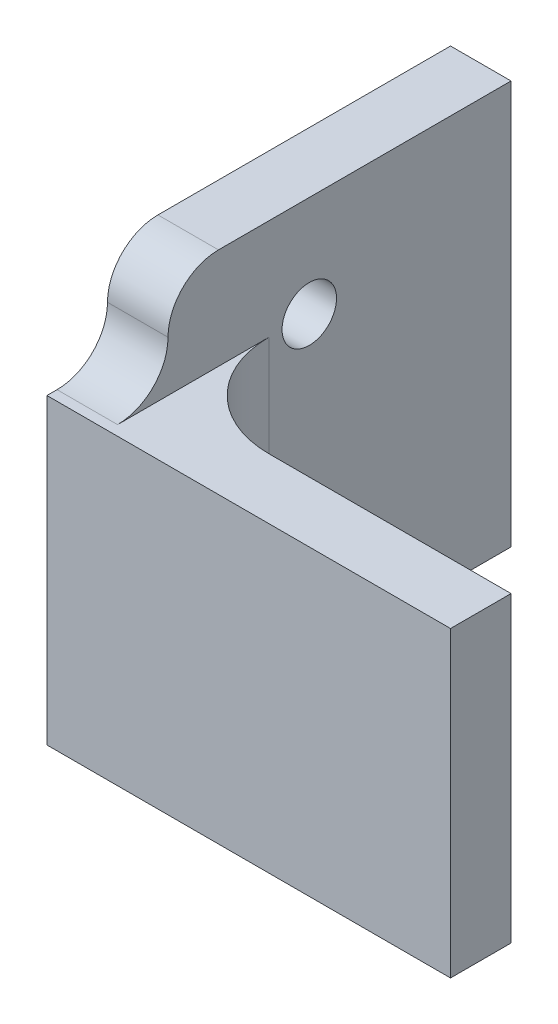
ISO-10303-21;
HEADER;
FILE_DESCRIPTION(('STEP AP214'),'2;1');
FILE_NAME('part.step','',(''),(''),'','','');
FILE_SCHEMA(('AUTOMOTIVE_DESIGN { 1 0 10303 214 1 1 1 1 }'));
ENDSEC;
DATA;
#1=APPLICATION_CONTEXT('core data for automotive mechanical design processes');
#2=APPLICATION_PROTOCOL_DEFINITION('international standard','automotive_design',2000,#1);
#3=PRODUCT_CONTEXT('',#1,'mechanical');
#4=PRODUCT('Part','Part','',(#3));
#5=PRODUCT_RELATED_PRODUCT_CATEGORY('part','',(#4));
#6=PRODUCT_DEFINITION_FORMATION('','',#4);
#7=PRODUCT_DEFINITION_CONTEXT('part definition',#1,'design');
#8=PRODUCT_DEFINITION('design','',#6,#7);
#9=PRODUCT_DEFINITION_SHAPE('','',#8);
#10=(LENGTH_UNIT() NAMED_UNIT(*) SI_UNIT(.MILLI.,.METRE.));
#11=(NAMED_UNIT(*) PLANE_ANGLE_UNIT() SI_UNIT($,.RADIAN.));
#12=(NAMED_UNIT(*) SI_UNIT($,.STERADIAN.) SOLID_ANGLE_UNIT());
#13=UNCERTAINTY_MEASURE_WITH_UNIT(LENGTH_MEASURE(1.E-05),#10,'distance_accuracy_value','');
#14=(GEOMETRIC_REPRESENTATION_CONTEXT(3) GLOBAL_UNCERTAINTY_ASSIGNED_CONTEXT((#13)) GLOBAL_UNIT_ASSIGNED_CONTEXT((#10,
#11,#12)) REPRESENTATION_CONTEXT('',''));
#15=CARTESIAN_POINT('',(0.,0.,0.));
#16=DIRECTION('',(0.,0.,1.));
#17=DIRECTION('',(1.,0.,0.));
#18=AXIS2_PLACEMENT_3D('',#15,#16,#17);
#19=CARTESIAN_POINT('',(17.,20.,0.));
#20=DIRECTION('',(0.,0.,1.));
#21=DIRECTION('',(1.,0.,0.));
#22=AXIS2_PLACEMENT_3D('',#19,#20,#21);
#23=PLANE('',#22);
#24=DIRECTION('',(-1.,0.,0.));
#25=VECTOR('',#24,1.);
#26=CARTESIAN_POINT('',(17.,0.,0.));
#27=LINE('',#26,#25);
#28=CARTESIAN_POINT('',(17.,0.,0.));
#29=VERTEX_POINT('',#28);
#30=CARTESIAN_POINT('',(5.,0.,0.));
#31=VERTEX_POINT('',#30);
#32=EDGE_CURVE('E157',#29,#31,#27,.T.);
#33=ORIENTED_EDGE('',*,*,#32,.T.);
#34=DIRECTION('',(0.,-1.,0.));
#35=VECTOR('',#34,1.);
#36=CARTESIAN_POINT('',(5.,15.,0.));
#37=LINE('',#36,#35);
#38=CARTESIAN_POINT('',(5.,15.,0.));
#39=VERTEX_POINT('',#38);
#40=EDGE_CURVE('E60',#31,#39,#37,.F.);
#41=ORIENTED_EDGE('',*,*,#40,.T.);
#42=DIRECTION('',(-1.,0.,0.));
#43=VECTOR('',#42,1.);
#44=CARTESIAN_POINT('',(17.,15.,0.));
#45=LINE('',#44,#43);
#46=CARTESIAN_POINT('',(17.,15.,0.));
#47=VERTEX_POINT('',#46);
#48=EDGE_CURVE('E119',#47,#39,#45,.T.);
#49=ORIENTED_EDGE('',*,*,#48,.F.);
#50=DIRECTION('',(0.,-1.,0.));
#51=VECTOR('',#50,1.);
#52=CARTESIAN_POINT('',(17.,20.,0.));
#53=LINE('',#52,#51);
#54=EDGE_CURVE('E128',#47,#29,#53,.T.);
#55=ORIENTED_EDGE('',*,*,#54,.T.);
#56=EDGE_LOOP('',(#33,#41,#49,#55));
#57=FACE_BOUND('',#56,.T.);
#58=ADVANCED_FACE('F39',(#57),#23,.F.);
#59=CARTESIAN_POINT('',(0.,20.,0.));
#60=DIRECTION('',(-1.,0.,0.));
#61=DIRECTION('',(0.,0.,1.));
#62=AXIS2_PLACEMENT_3D('',#59,#60,#61);
#63=PLANE('',#62);
#64=CARTESIAN_POINT('',(0.,15.,-7.));
#65=DIRECTION('',(1.,0.,0.));
#66=DIRECTION('',(0.,0.,-1.));
#67=AXIS2_PLACEMENT_3D('',#64,#65,#66);
#68=CIRCLE('',#67,1.34999999999999);
#69=CARTESIAN_POINT('',(0.,15.,-8.34999999999999));
#70=VERTEX_POINT('',#69);
#71=EDGE_CURVE('E162',#70,#70,#68,.T.);
#72=ORIENTED_EDGE('',*,*,#71,.F.);
#73=EDGE_LOOP('',(#72));
#74=FACE_BOUND('',#73,.T.);
#75=CARTESIAN_POINT('',(0.,5.,-7.));
#76=DIRECTION('',(1.,0.,0.));
#77=DIRECTION('',(0.,0.,-1.));
#78=AXIS2_PLACEMENT_3D('',#75,#76,#77);
#79=CIRCLE('',#78,1.34999999999999);
#80=CARTESIAN_POINT('',(0.,5.,-8.34999999999999));
#81=VERTEX_POINT('',#80);
#82=EDGE_CURVE('E158',#81,#81,#79,.T.);
#83=ORIENTED_EDGE('',*,*,#82,.F.);
#84=EDGE_LOOP('',(#83));
#85=FACE_BOUND('',#84,.T.);
#86=DIRECTION('',(0.,0.,1.));
#87=VECTOR('',#86,1.);
#88=CARTESIAN_POINT('',(0.,15.,0.));
#89=LINE('',#88,#87);
#90=CARTESIAN_POINT('',(0.,15.,-5.));
#91=VERTEX_POINT('',#90);
#92=CARTESIAN_POINT('',(0.,15.,2.5));
#93=VERTEX_POINT('',#92);
#94=EDGE_CURVE('E169',#91,#93,#89,.T.);
#95=ORIENTED_EDGE('',*,*,#94,.F.);
#96=DIRECTION('',(0.,-1.,0.));
#97=VECTOR('',#96,1.);
#98=CARTESIAN_POINT('',(0.,0.,-5.));
#99=LINE('',#98,#97);
#100=CARTESIAN_POINT('',(0.,0.,-5.));
#101=VERTEX_POINT('',#100);
#102=EDGE_CURVE('E177',#91,#101,#99,.T.);
#103=ORIENTED_EDGE('',*,*,#102,.T.);
#104=DIRECTION('',(0.,0.,-1.));
#105=VECTOR('',#104,1.);
#106=CARTESIAN_POINT('',(0.,0.,0.));
#107=LINE('',#106,#105);
#108=CARTESIAN_POINT('',(0.,0.,-17.));
#109=VERTEX_POINT('',#108);
#110=EDGE_CURVE('E186',#101,#109,#107,.T.);
#111=ORIENTED_EDGE('',*,*,#110,.T.);
#112=DIRECTION('',(0.,-1.,0.));
#113=VECTOR('',#112,1.);
#114=CARTESIAN_POINT('',(0.,20.,-17.));
#115=LINE('',#114,#113);
#116=CARTESIAN_POINT('',(0.,20.,-17.));
#117=VERTEX_POINT('',#116);
#118=EDGE_CURVE('E150',#117,#109,#115,.T.);
#119=ORIENTED_EDGE('',*,*,#118,.F.);
#120=DIRECTION('',(0.,0.,-1.));
#121=VECTOR('',#120,1.);
#122=CARTESIAN_POINT('',(0.,20.,0.));
#123=LINE('',#122,#121);
#124=CARTESIAN_POINT('',(0.,20.,-2.5));
#125=VERTEX_POINT('',#124);
#126=EDGE_CURVE('E202',#125,#117,#123,.T.);
#127=ORIENTED_EDGE('',*,*,#126,.F.);
#128=CARTESIAN_POINT('',(0.,17.5,-2.5));
#129=DIRECTION('',(-1.,0.,0.));
#130=DIRECTION('',(0.,0.,1.));
#131=AXIS2_PLACEMENT_3D('',#128,#129,#130);
#132=CIRCLE('',#131,2.5);
#133=CARTESIAN_POINT('',(0.,17.5,0.));
#134=VERTEX_POINT('',#133);
#135=EDGE_CURVE('E165',#125,#134,#132,.F.);
#136=ORIENTED_EDGE('',*,*,#135,.T.);
#137=CARTESIAN_POINT('',(0.,17.5,2.5));
#138=DIRECTION('',(-1.,0.,0.));
#139=DIRECTION('',(0.,0.,1.));
#140=AXIS2_PLACEMENT_3D('',#137,#138,#139);
#141=CIRCLE('',#140,2.5);
#142=EDGE_CURVE('E175',#134,#93,#141,.T.);
#143=ORIENTED_EDGE('',*,*,#142,.T.);
#144=EDGE_LOOP('',(#95,#103,#111,#119,#127,#136,#143));
#145=FACE_BOUND('',#144,.T.);
#146=ADVANCED_FACE('F184',(#74,#85,#145),#63,.F.);
#147=CARTESIAN_POINT('',(0.,20.,-17.));
#148=DIRECTION('',(0.,0.,1.));
#149=DIRECTION('',(1.,0.,0.));
#150=AXIS2_PLACEMENT_3D('',#147,#148,#149);
#151=PLANE('',#150);
#152=DIRECTION('',(-1.,0.,0.));
#153=VECTOR('',#152,1.);
#154=CARTESIAN_POINT('',(0.,0.,-17.));
#155=LINE('',#154,#153);
#156=CARTESIAN_POINT('',(-3.,0.,-17.));
#157=VERTEX_POINT('',#156);
#158=EDGE_CURVE('E191',#109,#157,#155,.T.);
#159=ORIENTED_EDGE('',*,*,#158,.T.);
#160=DIRECTION('',(0.,-1.,0.));
#161=VECTOR('',#160,1.);
#162=CARTESIAN_POINT('',(-3.,20.,-17.));
#163=LINE('',#162,#161);
#164=CARTESIAN_POINT('',(-3.,20.,-17.));
#165=VERTEX_POINT('',#164);
#166=EDGE_CURVE('E147',#165,#157,#163,.T.);
#167=ORIENTED_EDGE('',*,*,#166,.F.);
#168=DIRECTION('',(-1.,0.,0.));
#169=VECTOR('',#168,1.);
#170=CARTESIAN_POINT('',(0.,20.,-17.));
#171=LINE('',#170,#169);
#172=EDGE_CURVE('E141',#117,#165,#171,.T.);
#173=ORIENTED_EDGE('',*,*,#172,.F.);
#174=ORIENTED_EDGE('',*,*,#118,.T.);
#175=EDGE_LOOP('',(#159,#167,#173,#174));
#176=FACE_BOUND('',#175,.T.);
#177=ADVANCED_FACE('F233',(#176),#151,.F.);
#178=CARTESIAN_POINT('',(-3.,20.,-17.));
#179=DIRECTION('',(1.,0.,0.));
#180=DIRECTION('',(0.,0.,-1.));
#181=AXIS2_PLACEMENT_3D('',#178,#179,#180);
#182=PLANE('',#181);
#183=CARTESIAN_POINT('',(-3.,15.,-7.));
#184=DIRECTION('',(1.,0.,0.));
#185=DIRECTION('',(0.,0.,-1.));
#186=AXIS2_PLACEMENT_3D('',#183,#184,#185);
#187=CIRCLE('',#186,1.34999999999999);
#188=CARTESIAN_POINT('',(-3.,15.,-8.34999999999999));
#189=VERTEX_POINT('',#188);
#190=EDGE_CURVE('E159',#189,#189,#187,.T.);
#191=ORIENTED_EDGE('',*,*,#190,.T.);
#192=EDGE_LOOP('',(#191));
#193=FACE_BOUND('',#192,.T.);
#194=CARTESIAN_POINT('',(-3.,5.,-7.));
#195=DIRECTION('',(1.,0.,0.));
#196=DIRECTION('',(0.,0.,-1.));
#197=AXIS2_PLACEMENT_3D('',#194,#195,#196);
#198=CIRCLE('',#197,1.34999999999999);
#199=CARTESIAN_POINT('',(-3.,5.,-8.34999999999999));
#200=VERTEX_POINT('',#199);
#201=EDGE_CURVE('E154',#200,#200,#198,.T.);
#202=ORIENTED_EDGE('',*,*,#201,.T.);
#203=EDGE_LOOP('',(#202));
#204=FACE_BOUND('',#203,.T.);
#205=DIRECTION('',(0.,0.,1.));
#206=VECTOR('',#205,1.);
#207=CARTESIAN_POINT('',(-3.,15.,0.));
#208=LINE('',#207,#206);
#209=CARTESIAN_POINT('',(-3.,15.,2.5));
#210=VERTEX_POINT('',#209);
#211=CARTESIAN_POINT('',(-3.,15.,3.));
#212=VERTEX_POINT('',#211);
#213=EDGE_CURVE('E130',#210,#212,#208,.T.);
#214=ORIENTED_EDGE('',*,*,#213,.F.);
#215=CARTESIAN_POINT('',(-3.,17.5,2.5));
#216=DIRECTION('',(1.,0.,0.));
#217=DIRECTION('',(0.,0.,-1.));
#218=AXIS2_PLACEMENT_3D('',#215,#216,#217);
#219=CIRCLE('',#218,2.5);
#220=CARTESIAN_POINT('',(-3.,17.5,0.));
#221=VERTEX_POINT('',#220);
#222=EDGE_CURVE('E173',#210,#221,#219,.T.);
#223=ORIENTED_EDGE('',*,*,#222,.T.);
#224=CARTESIAN_POINT('',(-3.,17.5,-2.5));
#225=DIRECTION('',(1.,0.,0.));
#226=DIRECTION('',(0.,0.,-1.));
#227=AXIS2_PLACEMENT_3D('',#224,#225,#226);
#228=CIRCLE('',#227,2.5);
#229=CARTESIAN_POINT('',(-3.,20.,-2.5));
#230=VERTEX_POINT('',#229);
#231=EDGE_CURVE('E167',#221,#230,#228,.F.);
#232=ORIENTED_EDGE('',*,*,#231,.T.);
#233=DIRECTION('',(0.,0.,1.));
#234=VECTOR('',#233,1.);
#235=CARTESIAN_POINT('',(-3.,20.,-17.));
#236=LINE('',#235,#234);
#237=EDGE_CURVE('E136',#165,#230,#236,.T.);
#238=ORIENTED_EDGE('',*,*,#237,.F.);
#239=ORIENTED_EDGE('',*,*,#166,.T.);
#240=DIRECTION('',(0.,0.,1.));
#241=VECTOR('',#240,1.);
#242=CARTESIAN_POINT('',(-3.,0.,-17.));
#243=LINE('',#242,#241);
#244=CARTESIAN_POINT('',(-3.,0.,3.));
#245=VERTEX_POINT('',#244);
#246=EDGE_CURVE('E193',#157,#245,#243,.T.);
#247=ORIENTED_EDGE('',*,*,#246,.T.);
#248=DIRECTION('',(0.,-1.,0.));
#249=VECTOR('',#248,1.);
#250=CARTESIAN_POINT('',(-3.,20.,3.));
#251=LINE('',#250,#249);
#252=EDGE_CURVE('E138',#212,#245,#251,.T.);
#253=ORIENTED_EDGE('',*,*,#252,.F.);
#254=EDGE_LOOP('',(#214,#223,#232,#238,#239,#247,#253));
#255=FACE_BOUND('',#254,.T.);
#256=ADVANCED_FACE('F219',(#193,#204,#255),#182,.F.);
#257=CARTESIAN_POINT('',(-3.,20.,3.));
#258=DIRECTION('',(0.,0.,-1.));
#259=DIRECTION('',(-1.,0.,0.));
#260=AXIS2_PLACEMENT_3D('',#257,#258,#259);
#261=PLANE('',#260);
#262=DIRECTION('',(0.,-1.,0.));
#263=VECTOR('',#262,1.);
#264=CARTESIAN_POINT('',(17.,20.,3.));
#265=LINE('',#264,#263);
#266=CARTESIAN_POINT('',(17.,15.,3.));
#267=VERTEX_POINT('',#266);
#268=CARTESIAN_POINT('',(17.,0.,3.));
#269=VERTEX_POINT('',#268);
#270=EDGE_CURVE('E135',#267,#269,#265,.T.);
#271=ORIENTED_EDGE('',*,*,#270,.F.);
#272=DIRECTION('',(1.,0.,0.));
#273=VECTOR('',#272,1.);
#274=CARTESIAN_POINT('',(17.,15.,3.));
#275=LINE('',#274,#273);
#276=EDGE_CURVE('E122',#212,#267,#275,.T.);
#277=ORIENTED_EDGE('',*,*,#276,.F.);
#278=ORIENTED_EDGE('',*,*,#252,.T.);
#279=DIRECTION('',(1.,0.,0.));
#280=VECTOR('',#279,1.);
#281=CARTESIAN_POINT('',(-3.,0.,3.));
#282=LINE('',#281,#280);
#283=EDGE_CURVE('E198',#245,#269,#282,.T.);
#284=ORIENTED_EDGE('',*,*,#283,.T.);
#285=EDGE_LOOP('',(#271,#277,#278,#284));
#286=FACE_BOUND('',#285,.T.);
#287=ADVANCED_FACE('F218',(#286),#261,.F.);
#288=CARTESIAN_POINT('',(17.,20.,3.));
#289=DIRECTION('',(-1.,0.,0.));
#290=DIRECTION('',(0.,0.,1.));
#291=AXIS2_PLACEMENT_3D('',#288,#289,#290);
#292=PLANE('',#291);
#293=ORIENTED_EDGE('',*,*,#54,.F.);
#294=DIRECTION('',(0.,0.,-1.));
#295=VECTOR('',#294,1.);
#296=CARTESIAN_POINT('',(17.,15.,0.));
#297=LINE('',#296,#295);
#298=EDGE_CURVE('E116',#267,#47,#297,.T.);
#299=ORIENTED_EDGE('',*,*,#298,.F.);
#300=ORIENTED_EDGE('',*,*,#270,.T.);
#301=DIRECTION('',(0.,0.,-1.));
#302=VECTOR('',#301,1.);
#303=CARTESIAN_POINT('',(17.,0.,3.));
#304=LINE('',#303,#302);
#305=EDGE_CURVE('E134',#269,#29,#304,.T.);
#306=ORIENTED_EDGE('',*,*,#305,.T.);
#307=EDGE_LOOP('',(#293,#299,#300,#306));
#308=FACE_BOUND('',#307,.T.);
#309=ADVANCED_FACE('F132',(#308),#292,.F.);
#310=CARTESIAN_POINT('',(0.,20.,0.));
#311=DIRECTION('',(0.,-1.,0.));
#312=DIRECTION('',(0.,0.,-1.));
#313=AXIS2_PLACEMENT_3D('',#310,#311,#312);
#314=PLANE('',#313);
#315=ORIENTED_EDGE('',*,*,#237,.T.);
#316=DIRECTION('',(1.,0.,0.));
#317=VECTOR('',#316,1.);
#318=CARTESIAN_POINT('',(0.,20.,-2.5));
#319=LINE('',#318,#317);
#320=EDGE_CURVE('E153',#230,#125,#319,.T.);
#321=ORIENTED_EDGE('',*,*,#320,.T.);
#322=ORIENTED_EDGE('',*,*,#126,.T.);
#323=ORIENTED_EDGE('',*,*,#172,.T.);
#324=EDGE_LOOP('',(#315,#321,#322,#323));
#325=FACE_BOUND('',#324,.T.);
#326=ADVANCED_FACE('F229',(#325),#314,.F.);
#327=CARTESIAN_POINT('',(0.,0.,0.));
#328=DIRECTION('',(0.,-1.,0.));
#329=DIRECTION('',(0.,0.,-1.));
#330=AXIS2_PLACEMENT_3D('',#327,#328,#329);
#331=PLANE('',#330);
#332=ORIENTED_EDGE('',*,*,#32,.F.);
#333=ORIENTED_EDGE('',*,*,#305,.F.);
#334=ORIENTED_EDGE('',*,*,#283,.F.);
#335=ORIENTED_EDGE('',*,*,#246,.F.);
#336=ORIENTED_EDGE('',*,*,#158,.F.);
#337=ORIENTED_EDGE('',*,*,#110,.F.);
#338=CARTESIAN_POINT('',(5.,0.,-5.));
#339=DIRECTION('',(0.,-1.,0.));
#340=DIRECTION('',(0.,0.,-1.));
#341=AXIS2_PLACEMENT_3D('',#338,#339,#340);
#342=CIRCLE('',#341,5.);
#343=EDGE_CURVE('E47',#101,#31,#342,.F.);
#344=ORIENTED_EDGE('',*,*,#343,.T.);
#345=EDGE_LOOP('',(#332,#333,#334,#335,#336,#337,#344));
#346=FACE_BOUND('',#345,.T.);
#347=ADVANCED_FACE('F189',(#346),#331,.T.);
#348=CARTESIAN_POINT('',(0.,5.,-7.));
#349=DIRECTION('',(1.,0.,0.));
#350=DIRECTION('',(0.,0.,-1.));
#351=AXIS2_PLACEMENT_3D('',#348,#349,#350);
#352=CYLINDRICAL_SURFACE('',#351,1.34999999999999);
#353=ORIENTED_EDGE('',*,*,#82,.T.);
#354=EDGE_LOOP('',(#353));
#355=FACE_BOUND('',#354,.T.);
#356=ORIENTED_EDGE('',*,*,#201,.F.);
#357=EDGE_LOOP('',(#356));
#358=FACE_BOUND('',#357,.T.);
#359=ADVANCED_FACE('F263',(#355,#358),#352,.F.);
#360=CARTESIAN_POINT('',(0.,15.,-7.));
#361=DIRECTION('',(1.,0.,0.));
#362=DIRECTION('',(0.,0.,-1.));
#363=AXIS2_PLACEMENT_3D('',#360,#361,#362);
#364=CYLINDRICAL_SURFACE('',#363,1.34999999999999);
#365=ORIENTED_EDGE('',*,*,#71,.T.);
#366=EDGE_LOOP('',(#365));
#367=FACE_BOUND('',#366,.T.);
#368=ORIENTED_EDGE('',*,*,#190,.F.);
#369=EDGE_LOOP('',(#368));
#370=FACE_BOUND('',#369,.T.);
#371=ADVANCED_FACE('F256',(#367,#370),#364,.F.);
#372=CARTESIAN_POINT('',(0.,15.,0.));
#373=DIRECTION('',(0.,-1.,0.));
#374=DIRECTION('',(0.,0.,-1.));
#375=AXIS2_PLACEMENT_3D('',#372,#373,#374);
#376=PLANE('',#375);
#377=ORIENTED_EDGE('',*,*,#94,.T.);
#378=DIRECTION('',(-1.,0.,0.));
#379=VECTOR('',#378,1.);
#380=CARTESIAN_POINT('',(-3.,15.,2.5));
#381=LINE('',#380,#379);
#382=EDGE_CURVE('E171',#93,#210,#381,.T.);
#383=ORIENTED_EDGE('',*,*,#382,.T.);
#384=ORIENTED_EDGE('',*,*,#213,.T.);
#385=ORIENTED_EDGE('',*,*,#276,.T.);
#386=ORIENTED_EDGE('',*,*,#298,.T.);
#387=ORIENTED_EDGE('',*,*,#48,.T.);
#388=CARTESIAN_POINT('',(5.,15.,-5.));
#389=DIRECTION('',(0.,-1.,0.));
#390=DIRECTION('',(0.,0.,-1.));
#391=AXIS2_PLACEMENT_3D('',#388,#389,#390);
#392=CIRCLE('',#391,5.);
#393=EDGE_CURVE('E11',#39,#91,#392,.T.);
#394=ORIENTED_EDGE('',*,*,#393,.T.);
#395=EDGE_LOOP('',(#377,#383,#384,#385,#386,#387,#394));
#396=FACE_BOUND('',#395,.T.);
#397=ADVANCED_FACE('F118',(#396),#376,.F.);
#398=CARTESIAN_POINT('',(0.,17.5,2.5));
#399=DIRECTION('',(1.,0.,0.));
#400=DIRECTION('',(0.,0.,-1.));
#401=AXIS2_PLACEMENT_3D('',#398,#399,#400);
#402=CYLINDRICAL_SURFACE('',#401,2.5);
#403=DIRECTION('',(-1.,0.,0.));
#404=VECTOR('',#403,1.);
#405=CARTESIAN_POINT('',(0.,17.5,0.));
#406=LINE('',#405,#404);
#407=EDGE_CURVE('E126',#221,#134,#406,.F.);
#408=ORIENTED_EDGE('',*,*,#407,.F.);
#409=ORIENTED_EDGE('',*,*,#222,.F.);
#410=ORIENTED_EDGE('',*,*,#382,.F.);
#411=ORIENTED_EDGE('',*,*,#142,.F.);
#412=EDGE_LOOP('',(#408,#409,#410,#411));
#413=FACE_BOUND('',#412,.T.);
#414=ADVANCED_FACE('F225',(#413),#402,.F.);
#415=CARTESIAN_POINT('',(0.,17.5,-2.5));
#416=DIRECTION('',(1.,0.,0.));
#417=DIRECTION('',(0.,0.,-1.));
#418=AXIS2_PLACEMENT_3D('',#415,#416,#417);
#419=CYLINDRICAL_SURFACE('',#418,2.5);
#420=ORIENTED_EDGE('',*,*,#231,.F.);
#421=ORIENTED_EDGE('',*,*,#407,.T.);
#422=ORIENTED_EDGE('',*,*,#135,.F.);
#423=ORIENTED_EDGE('',*,*,#320,.F.);
#424=EDGE_LOOP('',(#420,#421,#422,#423));
#425=FACE_BOUND('',#424,.T.);
#426=ADVANCED_FACE('F231',(#425),#419,.T.);
#427=CARTESIAN_POINT('',(5.,20.,-5.));
#428=DIRECTION('',(0.,1.,0.));
#429=DIRECTION('',(0.,0.,1.));
#430=AXIS2_PLACEMENT_3D('',#427,#428,#429);
#431=CYLINDRICAL_SURFACE('',#430,5.);
#432=ORIENTED_EDGE('',*,*,#393,.F.);
#433=ORIENTED_EDGE('',*,*,#40,.F.);
#434=ORIENTED_EDGE('',*,*,#343,.F.);
#435=ORIENTED_EDGE('',*,*,#102,.F.);
#436=EDGE_LOOP('',(#432,#433,#434,#435));
#437=FACE_BOUND('',#436,.T.);
#438=ADVANCED_FACE('F41',(#437),#431,.F.);
#439=CLOSED_SHELL('',(#58,#146,#177,#256,#287,#309,#326,#347,#359,#371,#397,#414,#426,#438));
#440=MANIFOLD_SOLID_BREP('B2',#439);
#441=ADVANCED_BREP_SHAPE_REPRESENTATION('',(#18,#440),#14);
#442=SHAPE_DEFINITION_REPRESENTATION(#9,#441);
ENDSEC;
END-ISO-10303-21;
